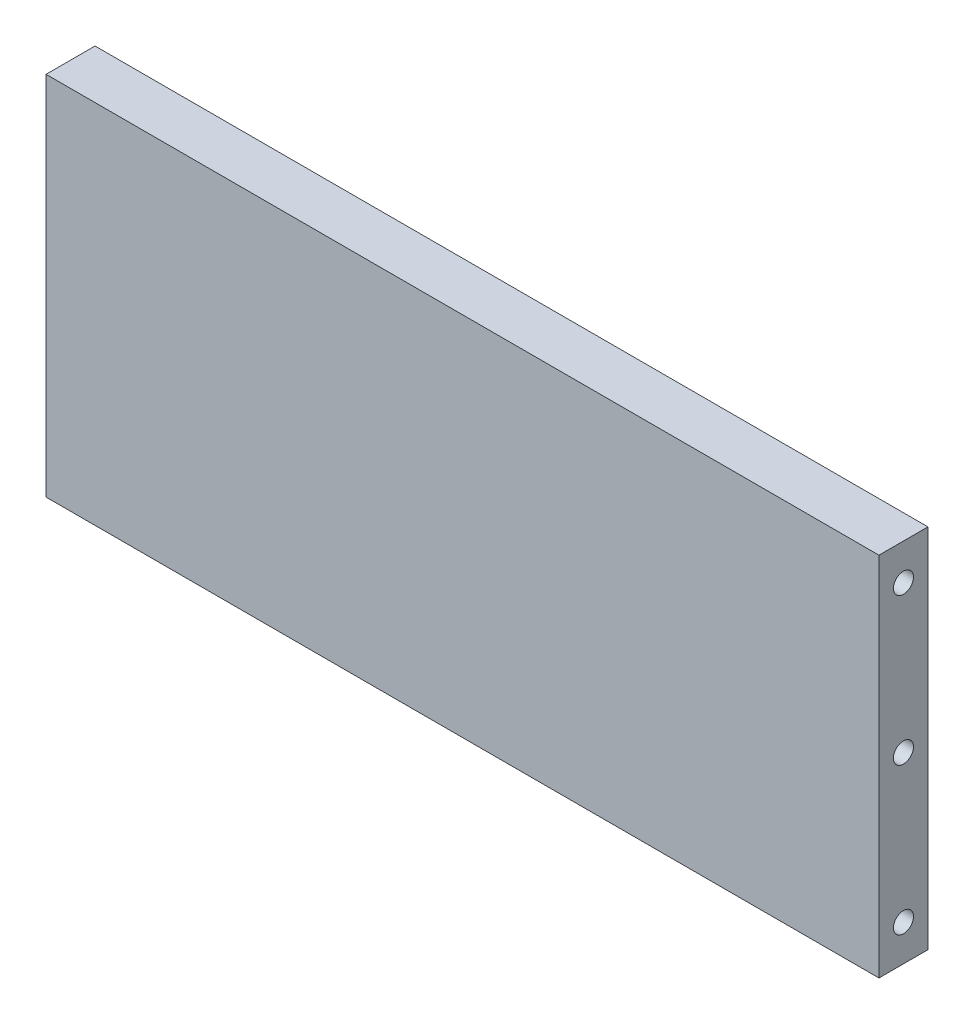
ISO-10303-21;
HEADER;
FILE_DESCRIPTION(('STEP AP214'),'2;1');
FILE_NAME('part.step','',(''),(''),'','','');
FILE_SCHEMA(('AUTOMOTIVE_DESIGN { 1 0 10303 214 1 1 1 1 }'));
ENDSEC;
DATA;
#1=APPLICATION_CONTEXT('core data for automotive mechanical design processes');
#2=APPLICATION_PROTOCOL_DEFINITION('international standard','automotive_design',2000,#1);
#3=PRODUCT_CONTEXT('',#1,'mechanical');
#4=PRODUCT('Part','Part','',(#3));
#5=PRODUCT_RELATED_PRODUCT_CATEGORY('part','',(#4));
#6=PRODUCT_DEFINITION_FORMATION('','',#4);
#7=PRODUCT_DEFINITION_CONTEXT('part definition',#1,'design');
#8=PRODUCT_DEFINITION('design','',#6,#7);
#9=PRODUCT_DEFINITION_SHAPE('','',#8);
#10=(LENGTH_UNIT() NAMED_UNIT(*) SI_UNIT(.MILLI.,.METRE.));
#11=(NAMED_UNIT(*) PLANE_ANGLE_UNIT() SI_UNIT($,.RADIAN.));
#12=(NAMED_UNIT(*) SI_UNIT($,.STERADIAN.) SOLID_ANGLE_UNIT());
#13=UNCERTAINTY_MEASURE_WITH_UNIT(LENGTH_MEASURE(1.E-05),#10,'distance_accuracy_value','');
#14=(GEOMETRIC_REPRESENTATION_CONTEXT(3) GLOBAL_UNCERTAINTY_ASSIGNED_CONTEXT((#13)) GLOBAL_UNIT_ASSIGNED_CONTEXT((#10,
#11,#12)) REPRESENTATION_CONTEXT('',''));
#15=CARTESIAN_POINT('',(0.,0.,0.));
#16=DIRECTION('',(0.,0.,1.));
#17=DIRECTION('',(1.,0.,0.));
#18=AXIS2_PLACEMENT_3D('',#15,#16,#17);
#19=CARTESIAN_POINT('',(85.,-30.,0.));
#20=DIRECTION('',(-1.,0.,0.));
#21=DIRECTION('',(0.,0.,1.));
#22=AXIS2_PLACEMENT_3D('',#19,#20,#21);
#23=CYLINDRICAL_SURFACE('',#22,2.05);
#24=CARTESIAN_POINT('',(-85.,-30.,0.));
#25=DIRECTION('',(1.,0.,0.));
#26=DIRECTION('',(0.,0.,-1.));
#27=AXIS2_PLACEMENT_3D('',#24,#25,#26);
#28=CIRCLE('',#27,2.05);
#29=CARTESIAN_POINT('',(-85.,-30.,-2.05000000000001));
#30=VERTEX_POINT('',#29);
#31=EDGE_CURVE('E164',#30,#30,#28,.T.);
#32=ORIENTED_EDGE('',*,*,#31,.F.);
#33=EDGE_LOOP('',(#32));
#34=FACE_BOUND('',#33,.T.);
#35=CARTESIAN_POINT('',(-75.,-30.,0.));
#36=DIRECTION('',(1.,0.,0.));
#37=DIRECTION('',(0.,0.,-1.));
#38=AXIS2_PLACEMENT_3D('',#35,#36,#37);
#39=CIRCLE('',#38,2.05);
#40=CARTESIAN_POINT('',(-75.,-30.,-2.05000000000001));
#41=VERTEX_POINT('',#40);
#42=EDGE_CURVE('E194',#41,#41,#39,.T.);
#43=ORIENTED_EDGE('',*,*,#42,.T.);
#44=EDGE_LOOP('',(#43));
#45=FACE_BOUND('',#44,.T.);
#46=ADVANCED_FACE('F43',(#34,#45),#23,.F.);
#47=CARTESIAN_POINT('',(85.,0.,0.));
#48=DIRECTION('',(-1.,0.,0.));
#49=DIRECTION('',(0.,0.,1.));
#50=AXIS2_PLACEMENT_3D('',#47,#48,#49);
#51=CYLINDRICAL_SURFACE('',#50,2.05);
#52=CARTESIAN_POINT('',(-85.,0.,0.));
#53=DIRECTION('',(1.,0.,0.));
#54=DIRECTION('',(0.,0.,-1.));
#55=AXIS2_PLACEMENT_3D('',#52,#53,#54);
#56=CIRCLE('',#55,2.05);
#57=CARTESIAN_POINT('',(-85.,0.,-2.05));
#58=VERTEX_POINT('',#57);
#59=EDGE_CURVE('E165',#58,#58,#56,.T.);
#60=ORIENTED_EDGE('',*,*,#59,.F.);
#61=EDGE_LOOP('',(#60));
#62=FACE_BOUND('',#61,.T.);
#63=CARTESIAN_POINT('',(-75.,0.,0.));
#64=DIRECTION('',(1.,0.,0.));
#65=DIRECTION('',(0.,0.,-1.));
#66=AXIS2_PLACEMENT_3D('',#63,#64,#65);
#67=CIRCLE('',#66,2.05);
#68=CARTESIAN_POINT('',(-75.,0.,-2.05));
#69=VERTEX_POINT('',#68);
#70=EDGE_CURVE('E189',#69,#69,#67,.T.);
#71=ORIENTED_EDGE('',*,*,#70,.T.);
#72=EDGE_LOOP('',(#71));
#73=FACE_BOUND('',#72,.T.);
#74=ADVANCED_FACE('F159',(#62,#73),#51,.F.);
#75=CARTESIAN_POINT('',(85.,30.,0.));
#76=DIRECTION('',(-1.,0.,0.));
#77=DIRECTION('',(0.,0.,1.));
#78=AXIS2_PLACEMENT_3D('',#75,#76,#77);
#79=CYLINDRICAL_SURFACE('',#78,2.05);
#80=CARTESIAN_POINT('',(-85.,30.,0.));
#81=DIRECTION('',(1.,0.,0.));
#82=DIRECTION('',(0.,0.,-1.));
#83=AXIS2_PLACEMENT_3D('',#80,#81,#82);
#84=CIRCLE('',#83,2.05);
#85=CARTESIAN_POINT('',(-85.,30.,-2.04999999999999));
#86=VERTEX_POINT('',#85);
#87=EDGE_CURVE('E180',#86,#86,#84,.T.);
#88=ORIENTED_EDGE('',*,*,#87,.F.);
#89=EDGE_LOOP('',(#88));
#90=FACE_BOUND('',#89,.T.);
#91=CARTESIAN_POINT('',(-75.,30.,0.));
#92=DIRECTION('',(1.,0.,0.));
#93=DIRECTION('',(0.,0.,-1.));
#94=AXIS2_PLACEMENT_3D('',#91,#92,#93);
#95=CIRCLE('',#94,2.05);
#96=CARTESIAN_POINT('',(-75.,30.,-2.04999999999999));
#97=VERTEX_POINT('',#96);
#98=EDGE_CURVE('E173',#97,#97,#95,.T.);
#99=ORIENTED_EDGE('',*,*,#98,.T.);
#100=EDGE_LOOP('',(#99));
#101=FACE_BOUND('',#100,.T.);
#102=ADVANCED_FACE('F301',(#90,#101),#79,.F.);
#103=CARTESIAN_POINT('',(85.,0.,0.));
#104=DIRECTION('',(1.,0.,0.));
#105=DIRECTION('',(0.,0.,-1.));
#106=AXIS2_PLACEMENT_3D('',#103,#104,#105);
#107=PLANE('',#106);
#108=CARTESIAN_POINT('',(85.,-30.,0.));
#109=DIRECTION('',(1.,0.,0.));
#110=DIRECTION('',(0.,0.,-1.));
#111=AXIS2_PLACEMENT_3D('',#108,#109,#110);
#112=CIRCLE('',#111,2.05);
#113=CARTESIAN_POINT('',(85.,-30.,-2.05000000000001));
#114=VERTEX_POINT('',#113);
#115=EDGE_CURVE('E169',#114,#114,#112,.T.);
#116=ORIENTED_EDGE('',*,*,#115,.F.);
#117=EDGE_LOOP('',(#116));
#118=FACE_BOUND('',#117,.T.);
#119=DIRECTION('',(0.,1.,0.));
#120=VECTOR('',#119,1.);
#121=CARTESIAN_POINT('',(85.,37.37,-5.));
#122=LINE('',#121,#120);
#123=CARTESIAN_POINT('',(85.,-37.37,-5.00000000000001));
#124=VERTEX_POINT('',#123);
#125=CARTESIAN_POINT('',(85.,37.37,-5.));
#126=VERTEX_POINT('',#125);
#127=EDGE_CURVE('E106',#124,#126,#122,.T.);
#128=ORIENTED_EDGE('',*,*,#127,.T.);
#129=DIRECTION('',(0.,0.,1.));
#130=VECTOR('',#129,1.);
#131=CARTESIAN_POINT('',(85.,37.37,5.));
#132=LINE('',#131,#130);
#133=CARTESIAN_POINT('',(85.,37.37,5.));
#134=VERTEX_POINT('',#133);
#135=EDGE_CURVE('E100',#126,#134,#132,.T.);
#136=ORIENTED_EDGE('',*,*,#135,.T.);
#137=DIRECTION('',(0.,-1.,0.));
#138=VECTOR('',#137,1.);
#139=CARTESIAN_POINT('',(85.,37.37,5.));
#140=LINE('',#139,#138);
#141=CARTESIAN_POINT('',(85.,-37.37,4.99999999999999));
#142=VERTEX_POINT('',#141);
#143=EDGE_CURVE('E104',#134,#142,#140,.T.);
#144=ORIENTED_EDGE('',*,*,#143,.T.);
#145=DIRECTION('',(0.,0.,-1.));
#146=VECTOR('',#145,1.);
#147=CARTESIAN_POINT('',(85.,-37.37,4.99999999999999));
#148=LINE('',#147,#146);
#149=EDGE_CURVE('E64',#142,#124,#148,.T.);
#150=ORIENTED_EDGE('',*,*,#149,.T.);
#151=EDGE_LOOP('',(#128,#136,#144,#150));
#152=FACE_BOUND('',#151,.T.);
#153=CARTESIAN_POINT('',(85.,30.,0.));
#154=DIRECTION('',(1.,0.,0.));
#155=DIRECTION('',(0.,0.,-1.));
#156=AXIS2_PLACEMENT_3D('',#153,#154,#155);
#157=CIRCLE('',#156,2.05);
#158=CARTESIAN_POINT('',(85.,30.,-2.04999999999999));
#159=VERTEX_POINT('',#158);
#160=EDGE_CURVE('E131',#159,#159,#157,.T.);
#161=ORIENTED_EDGE('',*,*,#160,.F.);
#162=EDGE_LOOP('',(#161));
#163=FACE_BOUND('',#162,.T.);
#164=CARTESIAN_POINT('',(85.,0.,0.));
#165=DIRECTION('',(1.,0.,0.));
#166=DIRECTION('',(0.,0.,-1.));
#167=AXIS2_PLACEMENT_3D('',#164,#165,#166);
#168=CIRCLE('',#167,2.05);
#169=CARTESIAN_POINT('',(85.,0.,-2.05));
#170=VERTEX_POINT('',#169);
#171=EDGE_CURVE('E162',#170,#170,#168,.T.);
#172=ORIENTED_EDGE('',*,*,#171,.F.);
#173=EDGE_LOOP('',(#172));
#174=FACE_BOUND('',#173,.T.);
#175=ADVANCED_FACE('F101',(#118,#152,#163,#174),#107,.T.);
#176=CARTESIAN_POINT('',(-85.,0.,0.));
#177=DIRECTION('',(1.,0.,0.));
#178=DIRECTION('',(0.,0.,-1.));
#179=AXIS2_PLACEMENT_3D('',#176,#177,#178);
#180=PLANE('',#179);
#181=DIRECTION('',(0.,1.,0.));
#182=VECTOR('',#181,1.);
#183=CARTESIAN_POINT('',(-85.,37.37,-5.));
#184=LINE('',#183,#182);
#185=CARTESIAN_POINT('',(-85.,-37.37,-5.00000000000001));
#186=VERTEX_POINT('',#185);
#187=CARTESIAN_POINT('',(-85.,37.37,-5.));
#188=VERTEX_POINT('',#187);
#189=EDGE_CURVE('E127',#186,#188,#184,.T.);
#190=ORIENTED_EDGE('',*,*,#189,.F.);
#191=DIRECTION('',(0.,0.,-1.));
#192=VECTOR('',#191,1.);
#193=CARTESIAN_POINT('',(-85.,-37.37,4.99999999999999));
#194=LINE('',#193,#192);
#195=CARTESIAN_POINT('',(-85.,-37.37,4.99999999999999));
#196=VERTEX_POINT('',#195);
#197=EDGE_CURVE('E92',#196,#186,#194,.T.);
#198=ORIENTED_EDGE('',*,*,#197,.F.);
#199=DIRECTION('',(0.,-1.,0.));
#200=VECTOR('',#199,1.);
#201=CARTESIAN_POINT('',(-85.,37.37,5.));
#202=LINE('',#201,#200);
#203=CARTESIAN_POINT('',(-85.,37.37,5.));
#204=VERTEX_POINT('',#203);
#205=EDGE_CURVE('E85',#204,#196,#202,.T.);
#206=ORIENTED_EDGE('',*,*,#205,.F.);
#207=DIRECTION('',(0.,0.,1.));
#208=VECTOR('',#207,1.);
#209=CARTESIAN_POINT('',(-85.,37.37,5.));
#210=LINE('',#209,#208);
#211=EDGE_CURVE('E112',#188,#204,#210,.T.);
#212=ORIENTED_EDGE('',*,*,#211,.F.);
#213=EDGE_LOOP('',(#190,#198,#206,#212));
#214=FACE_BOUND('',#213,.T.);
#215=ORIENTED_EDGE('',*,*,#87,.T.);
#216=EDGE_LOOP('',(#215));
#217=FACE_BOUND('',#216,.T.);
#218=ORIENTED_EDGE('',*,*,#31,.T.);
#219=EDGE_LOOP('',(#218));
#220=FACE_BOUND('',#219,.T.);
#221=ORIENTED_EDGE('',*,*,#59,.T.);
#222=EDGE_LOOP('',(#221));
#223=FACE_BOUND('',#222,.T.);
#224=ADVANCED_FACE('F277',(#214,#217,#220,#223),#180,.F.);
#225=CARTESIAN_POINT('',(85.,37.37,-5.));
#226=DIRECTION('',(0.,0.,1.));
#227=DIRECTION('',(0.,-1.,0.));
#228=AXIS2_PLACEMENT_3D('',#225,#226,#227);
#229=PLANE('',#228);
#230=CARTESIAN_POINT('',(29.,24.5,-5.));
#231=DIRECTION('',(0.,0.,-1.));
#232=DIRECTION('',(0.,1.,0.));
#233=AXIS2_PLACEMENT_3D('',#230,#231,#232);
#234=CIRCLE('',#233,1.75);
#235=CARTESIAN_POINT('',(29.,26.25,-5.));
#236=VERTEX_POINT('',#235);
#237=EDGE_CURVE('E242',#236,#236,#234,.T.);
#238=ORIENTED_EDGE('',*,*,#237,.F.);
#239=EDGE_LOOP('',(#238));
#240=FACE_BOUND('',#239,.T.);
#241=CARTESIAN_POINT('',(29.,-24.5,-5.));
#242=DIRECTION('',(0.,0.,-1.));
#243=DIRECTION('',(0.,1.,0.));
#244=AXIS2_PLACEMENT_3D('',#241,#242,#243);
#245=CIRCLE('',#244,1.75);
#246=CARTESIAN_POINT('',(29.,-22.75,-5.));
#247=VERTEX_POINT('',#246);
#248=EDGE_CURVE('E250',#247,#247,#245,.T.);
#249=ORIENTED_EDGE('',*,*,#248,.F.);
#250=EDGE_LOOP('',(#249));
#251=FACE_BOUND('',#250,.T.);
#252=CARTESIAN_POINT('',(-29.,-24.5,-5.));
#253=DIRECTION('',(0.,0.,-1.));
#254=DIRECTION('',(0.,1.,0.));
#255=AXIS2_PLACEMENT_3D('',#252,#253,#254);
#256=CIRCLE('',#255,1.75);
#257=CARTESIAN_POINT('',(-29.,-22.75,-5.));
#258=VERTEX_POINT('',#257);
#259=EDGE_CURVE('E258',#258,#258,#256,.T.);
#260=ORIENTED_EDGE('',*,*,#259,.F.);
#261=EDGE_LOOP('',(#260));
#262=FACE_BOUND('',#261,.T.);
#263=CARTESIAN_POINT('',(-29.,24.5,-5.));
#264=DIRECTION('',(0.,0.,-1.));
#265=DIRECTION('',(0.,1.,0.));
#266=AXIS2_PLACEMENT_3D('',#263,#264,#265);
#267=CIRCLE('',#266,1.75);
#268=CARTESIAN_POINT('',(-29.,26.25,-5.));
#269=VERTEX_POINT('',#268);
#270=EDGE_CURVE('E234',#269,#269,#267,.T.);
#271=ORIENTED_EDGE('',*,*,#270,.F.);
#272=EDGE_LOOP('',(#271));
#273=FACE_BOUND('',#272,.T.);
#274=CARTESIAN_POINT('',(37.,-22.,-5.));
#275=DIRECTION('',(0.,0.,-1.));
#276=DIRECTION('',(0.,1.,0.));
#277=AXIS2_PLACEMENT_3D('',#274,#275,#276);
#278=CIRCLE('',#277,1.75);
#279=CARTESIAN_POINT('',(37.,-20.25,-5.));
#280=VERTEX_POINT('',#279);
#281=EDGE_CURVE('E211',#280,#280,#278,.T.);
#282=ORIENTED_EDGE('',*,*,#281,.F.);
#283=EDGE_LOOP('',(#282));
#284=FACE_BOUND('',#283,.T.);
#285=CARTESIAN_POINT('',(-37.,-22.,-5.));
#286=DIRECTION('',(0.,0.,-1.));
#287=DIRECTION('',(0.,1.,0.));
#288=AXIS2_PLACEMENT_3D('',#285,#286,#287);
#289=CIRCLE('',#288,1.75);
#290=CARTESIAN_POINT('',(-37.,-20.25,-5.));
#291=VERTEX_POINT('',#290);
#292=EDGE_CURVE('E220',#291,#291,#289,.T.);
#293=ORIENTED_EDGE('',*,*,#292,.F.);
#294=EDGE_LOOP('',(#293));
#295=FACE_BOUND('',#294,.T.);
#296=CARTESIAN_POINT('',(-37.,22.,-5.));
#297=DIRECTION('',(0.,0.,-1.));
#298=DIRECTION('',(0.,1.,0.));
#299=AXIS2_PLACEMENT_3D('',#296,#297,#298);
#300=CIRCLE('',#299,1.75);
#301=CARTESIAN_POINT('',(-37.,23.75,-5.));
#302=VERTEX_POINT('',#301);
#303=EDGE_CURVE('E228',#302,#302,#300,.T.);
#304=ORIENTED_EDGE('',*,*,#303,.F.);
#305=EDGE_LOOP('',(#304));
#306=FACE_BOUND('',#305,.T.);
#307=CARTESIAN_POINT('',(37.,22.,-5.));
#308=DIRECTION('',(0.,0.,-1.));
#309=DIRECTION('',(0.,1.,0.));
#310=AXIS2_PLACEMENT_3D('',#307,#308,#309);
#311=CIRCLE('',#310,1.75);
#312=CARTESIAN_POINT('',(37.,23.75,-5.));
#313=VERTEX_POINT('',#312);
#314=EDGE_CURVE('E203',#313,#313,#311,.T.);
#315=ORIENTED_EDGE('',*,*,#314,.F.);
#316=EDGE_LOOP('',(#315));
#317=FACE_BOUND('',#316,.T.);
#318=ORIENTED_EDGE('',*,*,#189,.T.);
#319=DIRECTION('',(-1.,0.,0.));
#320=VECTOR('',#319,1.);
#321=CARTESIAN_POINT('',(85.,37.37,-5.));
#322=LINE('',#321,#320);
#323=EDGE_CURVE('E114',#126,#188,#322,.T.);
#324=ORIENTED_EDGE('',*,*,#323,.F.);
#325=ORIENTED_EDGE('',*,*,#127,.F.);
#326=DIRECTION('',(-1.,0.,0.));
#327=VECTOR('',#326,1.);
#328=CARTESIAN_POINT('',(85.,-37.37,-5.00000000000001));
#329=LINE('',#328,#327);
#330=EDGE_CURVE('E123',#124,#186,#329,.T.);
#331=ORIENTED_EDGE('',*,*,#330,.T.);
#332=EDGE_LOOP('',(#318,#324,#325,#331));
#333=FACE_BOUND('',#332,.T.);
#334=ADVANCED_FACE('F45',(#240,#251,#262,#273,#284,#295,#306,#317,#333),#229,.F.);
#335=CARTESIAN_POINT('',(85.,37.37,5.));
#336=DIRECTION('',(0.,-1.,0.));
#337=DIRECTION('',(0.,0.,-1.));
#338=AXIS2_PLACEMENT_3D('',#335,#336,#337);
#339=PLANE('',#338);
#340=ORIENTED_EDGE('',*,*,#211,.T.);
#341=DIRECTION('',(-1.,0.,0.));
#342=VECTOR('',#341,1.);
#343=CARTESIAN_POINT('',(85.,37.37,5.));
#344=LINE('',#343,#342);
#345=EDGE_CURVE('E110',#134,#204,#344,.T.);
#346=ORIENTED_EDGE('',*,*,#345,.F.);
#347=ORIENTED_EDGE('',*,*,#135,.F.);
#348=ORIENTED_EDGE('',*,*,#323,.T.);
#349=EDGE_LOOP('',(#340,#346,#347,#348));
#350=FACE_BOUND('',#349,.T.);
#351=ADVANCED_FACE('F111',(#350),#339,.F.);
#352=CARTESIAN_POINT('',(85.,37.37,5.));
#353=DIRECTION('',(0.,0.,-1.));
#354=DIRECTION('',(0.,1.,0.));
#355=AXIS2_PLACEMENT_3D('',#352,#353,#354);
#356=PLANE('',#355);
#357=ORIENTED_EDGE('',*,*,#205,.T.);
#358=DIRECTION('',(-1.,0.,0.));
#359=VECTOR('',#358,1.);
#360=CARTESIAN_POINT('',(85.,-37.37,4.99999999999999));
#361=LINE('',#360,#359);
#362=EDGE_CURVE('E115',#142,#196,#361,.T.);
#363=ORIENTED_EDGE('',*,*,#362,.F.);
#364=ORIENTED_EDGE('',*,*,#143,.F.);
#365=ORIENTED_EDGE('',*,*,#345,.T.);
#366=EDGE_LOOP('',(#357,#363,#364,#365));
#367=FACE_BOUND('',#366,.T.);
#368=ADVANCED_FACE('F117',(#367),#356,.F.);
#369=CARTESIAN_POINT('',(85.,-37.37,4.99999999999999));
#370=DIRECTION('',(0.,1.,0.));
#371=DIRECTION('',(0.,0.,1.));
#372=AXIS2_PLACEMENT_3D('',#369,#370,#371);
#373=PLANE('',#372);
#374=ORIENTED_EDGE('',*,*,#197,.T.);
#375=ORIENTED_EDGE('',*,*,#330,.F.);
#376=ORIENTED_EDGE('',*,*,#149,.F.);
#377=ORIENTED_EDGE('',*,*,#362,.T.);
#378=EDGE_LOOP('',(#374,#375,#376,#377));
#379=FACE_BOUND('',#378,.T.);
#380=ADVANCED_FACE('F317',(#379),#373,.F.);
#381=CARTESIAN_POINT('',(75.,30.,0.));
#382=DIRECTION('',(1.,0.,0.));
#383=DIRECTION('',(0.,0.,-1.));
#384=AXIS2_PLACEMENT_3D('',#381,#382,#383);
#385=CIRCLE('',#384,2.05);
#386=CARTESIAN_POINT('',(75.,30.,-2.04999999999999));
#387=VERTEX_POINT('',#386);
#388=EDGE_CURVE('E143',#387,#387,#385,.T.);
#389=ORIENTED_EDGE('',*,*,#388,.F.);
#390=EDGE_LOOP('',(#389));
#391=FACE_BOUND('',#390,.T.);
#392=ORIENTED_EDGE('',*,*,#160,.T.);
#393=EDGE_LOOP('',(#392));
#394=FACE_BOUND('',#393,.T.);
#395=ADVANCED_FACE('F308',(#391,#394),#79,.F.);
#396=CARTESIAN_POINT('',(75.,-30.,0.));
#397=DIRECTION('',(1.,0.,0.));
#398=DIRECTION('',(0.,0.,-1.));
#399=AXIS2_PLACEMENT_3D('',#396,#397,#398);
#400=CIRCLE('',#399,2.05);
#401=CARTESIAN_POINT('',(75.,-30.,-2.05000000000001));
#402=VERTEX_POINT('',#401);
#403=EDGE_CURVE('E11',#402,#402,#400,.T.);
#404=ORIENTED_EDGE('',*,*,#403,.F.);
#405=EDGE_LOOP('',(#404));
#406=FACE_BOUND('',#405,.T.);
#407=ORIENTED_EDGE('',*,*,#115,.T.);
#408=EDGE_LOOP('',(#407));
#409=FACE_BOUND('',#408,.T.);
#410=ADVANCED_FACE('F157',(#406,#409),#23,.F.);
#411=CARTESIAN_POINT('',(75.,0.,0.));
#412=DIRECTION('',(1.,0.,0.));
#413=DIRECTION('',(0.,0.,-1.));
#414=AXIS2_PLACEMENT_3D('',#411,#412,#413);
#415=CIRCLE('',#414,2.05);
#416=CARTESIAN_POINT('',(75.,0.,-2.05));
#417=VERTEX_POINT('',#416);
#418=EDGE_CURVE('E53',#417,#417,#415,.T.);
#419=ORIENTED_EDGE('',*,*,#418,.F.);
#420=EDGE_LOOP('',(#419));
#421=FACE_BOUND('',#420,.T.);
#422=ORIENTED_EDGE('',*,*,#171,.T.);
#423=EDGE_LOOP('',(#422));
#424=FACE_BOUND('',#423,.T.);
#425=ADVANCED_FACE('F153',(#421,#424),#51,.F.);
#426=CARTESIAN_POINT('',(-75.,0.,0.));
#427=DIRECTION('',(1.,0.,0.));
#428=DIRECTION('',(0.,0.,-1.));
#429=AXIS2_PLACEMENT_3D('',#426,#427,#428);
#430=PLANE('',#429);
#431=ORIENTED_EDGE('',*,*,#98,.F.);
#432=EDGE_LOOP('',(#431));
#433=FACE_BOUND('',#432,.T.);
#434=ADVANCED_FACE('F156',(#433),#430,.F.);
#435=CARTESIAN_POINT('',(75.,0.,0.));
#436=DIRECTION('',(1.,0.,0.));
#437=DIRECTION('',(0.,0.,-1.));
#438=AXIS2_PLACEMENT_3D('',#435,#436,#437);
#439=PLANE('',#438);
#440=ORIENTED_EDGE('',*,*,#388,.T.);
#441=EDGE_LOOP('',(#440));
#442=FACE_BOUND('',#441,.T.);
#443=ADVANCED_FACE('F356',(#442),#439,.T.);
#444=CARTESIAN_POINT('',(-75.,0.,0.));
#445=DIRECTION('',(1.,0.,0.));
#446=DIRECTION('',(0.,0.,-1.));
#447=AXIS2_PLACEMENT_3D('',#444,#445,#446);
#448=PLANE('',#447);
#449=ORIENTED_EDGE('',*,*,#70,.F.);
#450=EDGE_LOOP('',(#449));
#451=FACE_BOUND('',#450,.T.);
#452=ADVANCED_FACE('F363',(#451),#448,.F.);
#453=CARTESIAN_POINT('',(75.,0.,0.));
#454=DIRECTION('',(1.,0.,0.));
#455=DIRECTION('',(0.,0.,-1.));
#456=AXIS2_PLACEMENT_3D('',#453,#454,#455);
#457=PLANE('',#456);
#458=ORIENTED_EDGE('',*,*,#418,.T.);
#459=EDGE_LOOP('',(#458));
#460=FACE_BOUND('',#459,.T.);
#461=ADVANCED_FACE('F151',(#460),#457,.T.);
#462=CARTESIAN_POINT('',(-75.,0.,0.));
#463=DIRECTION('',(1.,0.,0.));
#464=DIRECTION('',(0.,0.,-1.));
#465=AXIS2_PLACEMENT_3D('',#462,#463,#464);
#466=PLANE('',#465);
#467=ORIENTED_EDGE('',*,*,#42,.F.);
#468=EDGE_LOOP('',(#467));
#469=FACE_BOUND('',#468,.T.);
#470=ADVANCED_FACE('F377',(#469),#466,.F.);
#471=CARTESIAN_POINT('',(75.,0.,0.));
#472=DIRECTION('',(1.,0.,0.));
#473=DIRECTION('',(0.,0.,-1.));
#474=AXIS2_PLACEMENT_3D('',#471,#472,#473);
#475=PLANE('',#474);
#476=ORIENTED_EDGE('',*,*,#403,.T.);
#477=EDGE_LOOP('',(#476));
#478=FACE_BOUND('',#477,.T.);
#479=ADVANCED_FACE('F384',(#478),#475,.T.);
#480=CARTESIAN_POINT('',(37.,22.,3.));
#481=DIRECTION('',(0.,0.,-1.));
#482=DIRECTION('',(0.,1.,0.));
#483=AXIS2_PLACEMENT_3D('',#480,#481,#482);
#484=CYLINDRICAL_SURFACE('',#483,1.75);
#485=CARTESIAN_POINT('',(37.,22.,3.));
#486=DIRECTION('',(0.,0.,-1.));
#487=DIRECTION('',(0.,1.,0.));
#488=AXIS2_PLACEMENT_3D('',#485,#486,#487);
#489=CIRCLE('',#488,1.75);
#490=CARTESIAN_POINT('',(37.,23.75,3.));
#491=VERTEX_POINT('',#490);
#492=EDGE_CURVE('E200',#491,#491,#489,.T.);
#493=ORIENTED_EDGE('',*,*,#492,.F.);
#494=EDGE_LOOP('',(#493));
#495=FACE_BOUND('',#494,.T.);
#496=ORIENTED_EDGE('',*,*,#314,.T.);
#497=EDGE_LOOP('',(#496));
#498=FACE_BOUND('',#497,.T.);
#499=ADVANCED_FACE('F392',(#495,#498),#484,.F.);
#500=CARTESIAN_POINT('',(37.,22.,3.));
#501=DIRECTION('',(0.,0.,-1.));
#502=DIRECTION('',(0.,1.,0.));
#503=AXIS2_PLACEMENT_3D('',#500,#501,#502);
#504=PLANE('',#503);
#505=ORIENTED_EDGE('',*,*,#492,.T.);
#506=EDGE_LOOP('',(#505));
#507=FACE_BOUND('',#506,.T.);
#508=ADVANCED_FACE('F400',(#507),#504,.T.);
#509=CARTESIAN_POINT('',(-37.,22.,3.));
#510=DIRECTION('',(0.,0.,-1.));
#511=DIRECTION('',(0.,1.,0.));
#512=AXIS2_PLACEMENT_3D('',#509,#510,#511);
#513=CYLINDRICAL_SURFACE('',#512,1.75);
#514=CARTESIAN_POINT('',(-37.,22.,3.));
#515=DIRECTION('',(0.,0.,-1.));
#516=DIRECTION('',(0.,1.,0.));
#517=AXIS2_PLACEMENT_3D('',#514,#515,#516);
#518=CIRCLE('',#517,1.75);
#519=CARTESIAN_POINT('',(-37.,23.75,3.));
#520=VERTEX_POINT('',#519);
#521=EDGE_CURVE('E207',#520,#520,#518,.T.);
#522=ORIENTED_EDGE('',*,*,#521,.F.);
#523=EDGE_LOOP('',(#522));
#524=FACE_BOUND('',#523,.T.);
#525=ORIENTED_EDGE('',*,*,#303,.T.);
#526=EDGE_LOOP('',(#525));
#527=FACE_BOUND('',#526,.T.);
#528=ADVANCED_FACE('F408',(#524,#527),#513,.F.);
#529=CARTESIAN_POINT('',(-37.,22.,3.));
#530=DIRECTION('',(0.,0.,-1.));
#531=DIRECTION('',(0.,1.,0.));
#532=AXIS2_PLACEMENT_3D('',#529,#530,#531);
#533=PLANE('',#532);
#534=ORIENTED_EDGE('',*,*,#521,.T.);
#535=EDGE_LOOP('',(#534));
#536=FACE_BOUND('',#535,.T.);
#537=ADVANCED_FACE('F417',(#536),#533,.T.);
#538=CARTESIAN_POINT('',(-37.,-22.,3.));
#539=DIRECTION('',(0.,0.,-1.));
#540=DIRECTION('',(0.,1.,0.));
#541=AXIS2_PLACEMENT_3D('',#538,#539,#540);
#542=CYLINDRICAL_SURFACE('',#541,1.75);
#543=CARTESIAN_POINT('',(-37.,-22.,3.));
#544=DIRECTION('',(0.,0.,-1.));
#545=DIRECTION('',(0.,1.,0.));
#546=AXIS2_PLACEMENT_3D('',#543,#544,#545);
#547=CIRCLE('',#546,1.75);
#548=CARTESIAN_POINT('',(-37.,-20.25,3.));
#549=VERTEX_POINT('',#548);
#550=EDGE_CURVE('E224',#549,#549,#547,.T.);
#551=ORIENTED_EDGE('',*,*,#550,.F.);
#552=EDGE_LOOP('',(#551));
#553=FACE_BOUND('',#552,.T.);
#554=ORIENTED_EDGE('',*,*,#292,.T.);
#555=EDGE_LOOP('',(#554));
#556=FACE_BOUND('',#555,.T.);
#557=ADVANCED_FACE('F425',(#553,#556),#542,.F.);
#558=CARTESIAN_POINT('',(-37.,-22.,3.));
#559=DIRECTION('',(0.,0.,-1.));
#560=DIRECTION('',(0.,1.,0.));
#561=AXIS2_PLACEMENT_3D('',#558,#559,#560);
#562=PLANE('',#561);
#563=ORIENTED_EDGE('',*,*,#550,.T.);
#564=EDGE_LOOP('',(#563));
#565=FACE_BOUND('',#564,.T.);
#566=ADVANCED_FACE('F433',(#565),#562,.T.);
#567=CARTESIAN_POINT('',(37.,-22.,3.));
#568=DIRECTION('',(0.,0.,-1.));
#569=DIRECTION('',(0.,1.,0.));
#570=AXIS2_PLACEMENT_3D('',#567,#568,#569);
#571=CYLINDRICAL_SURFACE('',#570,1.75);
#572=CARTESIAN_POINT('',(37.,-22.,3.));
#573=DIRECTION('',(0.,0.,-1.));
#574=DIRECTION('',(0.,1.,0.));
#575=AXIS2_PLACEMENT_3D('',#572,#573,#574);
#576=CIRCLE('',#575,1.75);
#577=CARTESIAN_POINT('',(37.,-20.25,3.));
#578=VERTEX_POINT('',#577);
#579=EDGE_CURVE('E215',#578,#578,#576,.T.);
#580=ORIENTED_EDGE('',*,*,#579,.F.);
#581=EDGE_LOOP('',(#580));
#582=FACE_BOUND('',#581,.T.);
#583=ORIENTED_EDGE('',*,*,#281,.T.);
#584=EDGE_LOOP('',(#583));
#585=FACE_BOUND('',#584,.T.);
#586=ADVANCED_FACE('F441',(#582,#585),#571,.F.);
#587=CARTESIAN_POINT('',(37.,-22.,3.));
#588=DIRECTION('',(0.,0.,-1.));
#589=DIRECTION('',(0.,1.,0.));
#590=AXIS2_PLACEMENT_3D('',#587,#588,#589);
#591=PLANE('',#590);
#592=ORIENTED_EDGE('',*,*,#579,.T.);
#593=EDGE_LOOP('',(#592));
#594=FACE_BOUND('',#593,.T.);
#595=ADVANCED_FACE('F449',(#594),#591,.T.);
#596=CARTESIAN_POINT('',(-29.,24.5,3.));
#597=DIRECTION('',(0.,0.,-1.));
#598=DIRECTION('',(0.,1.,0.));
#599=AXIS2_PLACEMENT_3D('',#596,#597,#598);
#600=CYLINDRICAL_SURFACE('',#599,1.75);
#601=CARTESIAN_POINT('',(-29.,24.5,3.));
#602=DIRECTION('',(0.,0.,-1.));
#603=DIRECTION('',(0.,1.,0.));
#604=AXIS2_PLACEMENT_3D('',#601,#602,#603);
#605=CIRCLE('',#604,1.75);
#606=CARTESIAN_POINT('',(-29.,26.25,3.));
#607=VERTEX_POINT('',#606);
#608=EDGE_CURVE('E216',#607,#607,#605,.T.);
#609=ORIENTED_EDGE('',*,*,#608,.F.);
#610=EDGE_LOOP('',(#609));
#611=FACE_BOUND('',#610,.T.);
#612=ORIENTED_EDGE('',*,*,#270,.T.);
#613=EDGE_LOOP('',(#612));
#614=FACE_BOUND('',#613,.T.);
#615=ADVANCED_FACE('F457',(#611,#614),#600,.F.);
#616=CARTESIAN_POINT('',(-29.,24.5,3.));
#617=DIRECTION('',(0.,0.,-1.));
#618=DIRECTION('',(0.,1.,0.));
#619=AXIS2_PLACEMENT_3D('',#616,#617,#618);
#620=PLANE('',#619);
#621=ORIENTED_EDGE('',*,*,#608,.T.);
#622=EDGE_LOOP('',(#621));
#623=FACE_BOUND('',#622,.T.);
#624=ADVANCED_FACE('F271',(#623),#620,.T.);
#625=CARTESIAN_POINT('',(-29.,-24.5,3.));
#626=DIRECTION('',(0.,0.,-1.));
#627=DIRECTION('',(0.,1.,0.));
#628=AXIS2_PLACEMENT_3D('',#625,#626,#627);
#629=CYLINDRICAL_SURFACE('',#628,1.75);
#630=CARTESIAN_POINT('',(-29.,-24.5,3.));
#631=DIRECTION('',(0.,0.,-1.));
#632=DIRECTION('',(0.,1.,0.));
#633=AXIS2_PLACEMENT_3D('',#630,#631,#632);
#634=CIRCLE('',#633,1.75);
#635=CARTESIAN_POINT('',(-29.,-22.75,3.));
#636=VERTEX_POINT('',#635);
#637=EDGE_CURVE('E238',#636,#636,#634,.T.);
#638=ORIENTED_EDGE('',*,*,#637,.F.);
#639=EDGE_LOOP('',(#638));
#640=FACE_BOUND('',#639,.T.);
#641=ORIENTED_EDGE('',*,*,#259,.T.);
#642=EDGE_LOOP('',(#641));
#643=FACE_BOUND('',#642,.T.);
#644=ADVANCED_FACE('F268',(#640,#643),#629,.F.);
#645=CARTESIAN_POINT('',(-29.,-24.5,3.));
#646=DIRECTION('',(0.,0.,-1.));
#647=DIRECTION('',(0.,1.,0.));
#648=AXIS2_PLACEMENT_3D('',#645,#646,#647);
#649=PLANE('',#648);
#650=ORIENTED_EDGE('',*,*,#637,.T.);
#651=EDGE_LOOP('',(#650));
#652=FACE_BOUND('',#651,.T.);
#653=ADVANCED_FACE('F266',(#652),#649,.T.);
#654=CARTESIAN_POINT('',(29.,-24.5,3.));
#655=DIRECTION('',(0.,0.,-1.));
#656=DIRECTION('',(0.,1.,0.));
#657=AXIS2_PLACEMENT_3D('',#654,#655,#656);
#658=CYLINDRICAL_SURFACE('',#657,1.75);
#659=CARTESIAN_POINT('',(29.,-24.5,3.));
#660=DIRECTION('',(0.,0.,-1.));
#661=DIRECTION('',(0.,1.,0.));
#662=AXIS2_PLACEMENT_3D('',#659,#660,#661);
#663=CIRCLE('',#662,1.75);
#664=CARTESIAN_POINT('',(29.,-22.75,3.));
#665=VERTEX_POINT('',#664);
#666=EDGE_CURVE('E254',#665,#665,#663,.T.);
#667=ORIENTED_EDGE('',*,*,#666,.F.);
#668=EDGE_LOOP('',(#667));
#669=FACE_BOUND('',#668,.T.);
#670=ORIENTED_EDGE('',*,*,#248,.T.);
#671=EDGE_LOOP('',(#670));
#672=FACE_BOUND('',#671,.T.);
#673=ADVANCED_FACE('F482',(#669,#672),#658,.F.);
#674=CARTESIAN_POINT('',(29.,-24.5,3.));
#675=DIRECTION('',(0.,0.,-1.));
#676=DIRECTION('',(0.,1.,0.));
#677=AXIS2_PLACEMENT_3D('',#674,#675,#676);
#678=PLANE('',#677);
#679=ORIENTED_EDGE('',*,*,#666,.T.);
#680=EDGE_LOOP('',(#679));
#681=FACE_BOUND('',#680,.T.);
#682=ADVANCED_FACE('F489',(#681),#678,.T.);
#683=CARTESIAN_POINT('',(29.,24.5,3.));
#684=DIRECTION('',(0.,0.,-1.));
#685=DIRECTION('',(0.,1.,0.));
#686=AXIS2_PLACEMENT_3D('',#683,#684,#685);
#687=CYLINDRICAL_SURFACE('',#686,1.75);
#688=CARTESIAN_POINT('',(29.,24.5,3.));
#689=DIRECTION('',(0.,0.,-1.));
#690=DIRECTION('',(0.,1.,0.));
#691=AXIS2_PLACEMENT_3D('',#688,#689,#690);
#692=CIRCLE('',#691,1.75);
#693=CARTESIAN_POINT('',(29.,26.25,3.));
#694=VERTEX_POINT('',#693);
#695=EDGE_CURVE('E246',#694,#694,#692,.T.);
#696=ORIENTED_EDGE('',*,*,#695,.F.);
#697=EDGE_LOOP('',(#696));
#698=FACE_BOUND('',#697,.T.);
#699=ORIENTED_EDGE('',*,*,#237,.T.);
#700=EDGE_LOOP('',(#699));
#701=FACE_BOUND('',#700,.T.);
#702=ADVANCED_FACE('F496',(#698,#701),#687,.F.);
#703=CARTESIAN_POINT('',(29.,24.5,3.));
#704=DIRECTION('',(0.,0.,-1.));
#705=DIRECTION('',(0.,1.,0.));
#706=AXIS2_PLACEMENT_3D('',#703,#704,#705);
#707=PLANE('',#706);
#708=ORIENTED_EDGE('',*,*,#695,.T.);
#709=EDGE_LOOP('',(#708));
#710=FACE_BOUND('',#709,.T.);
#711=ADVANCED_FACE('F504',(#710),#707,.T.);
#712=CLOSED_SHELL('',(#46,#74,#102,#175,#224,#334,#351,#368,#380,#395,#410,#425,#434,#443,#452,
#461,#470,#479,#499,#508,#528,#537,#557,#566,#586,#595,#615,#624,#644,#653,#673,#682,#702,#711));
#713=MANIFOLD_SOLID_BREP('B2',#712);
#714=ADVANCED_BREP_SHAPE_REPRESENTATION('',(#18,#713),#14);
#715=SHAPE_DEFINITION_REPRESENTATION(#9,#714);
ENDSEC;
END-ISO-10303-21;
